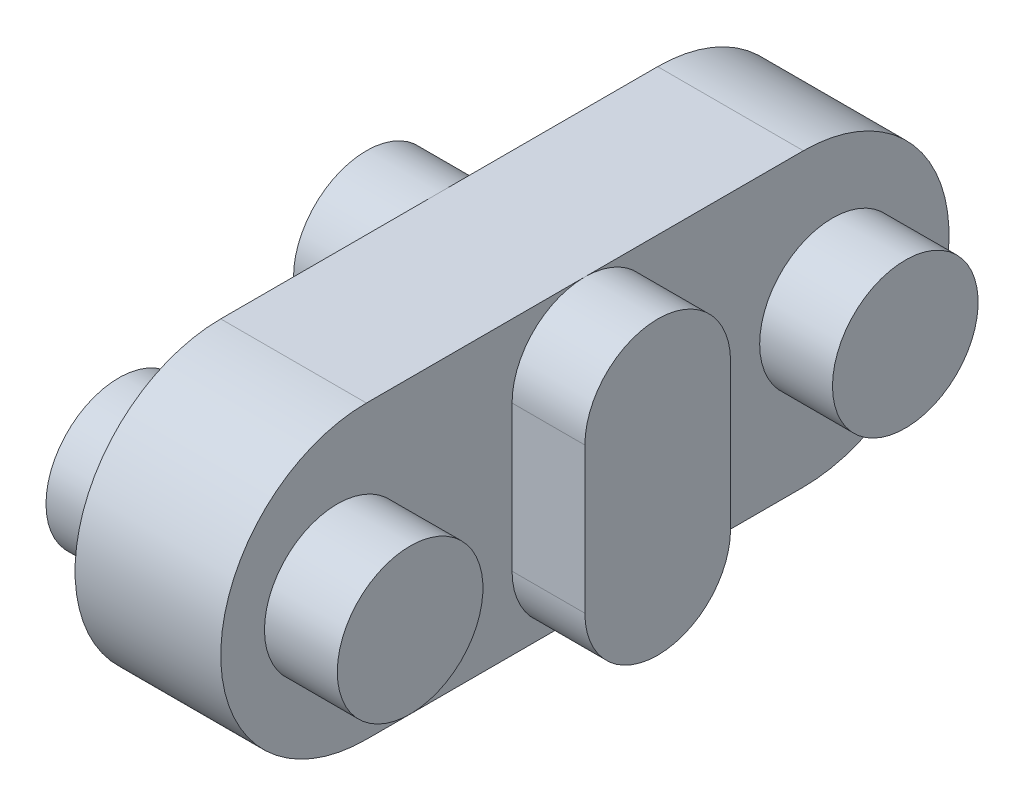
ISO-10303-21;
HEADER;
FILE_DESCRIPTION(('STEP AP214'),'2;1');
FILE_NAME('part.step','',(''),(''),'','','');
FILE_SCHEMA(('AUTOMOTIVE_DESIGN { 1 0 10303 214 1 1 1 1 }'));
ENDSEC;
DATA;
#1=APPLICATION_CONTEXT('core data for automotive mechanical design processes');
#2=APPLICATION_PROTOCOL_DEFINITION('international standard','automotive_design',2000,#1);
#3=PRODUCT_CONTEXT('',#1,'mechanical');
#4=PRODUCT('Part','Part','',(#3));
#5=PRODUCT_RELATED_PRODUCT_CATEGORY('part','',(#4));
#6=PRODUCT_DEFINITION_FORMATION('','',#4);
#7=PRODUCT_DEFINITION_CONTEXT('part definition',#1,'design');
#8=PRODUCT_DEFINITION('design','',#6,#7);
#9=PRODUCT_DEFINITION_SHAPE('','',#8);
#10=(LENGTH_UNIT() NAMED_UNIT(*) SI_UNIT(.MILLI.,.METRE.));
#11=(NAMED_UNIT(*) PLANE_ANGLE_UNIT() SI_UNIT($,.RADIAN.));
#12=(NAMED_UNIT(*) SI_UNIT($,.STERADIAN.) SOLID_ANGLE_UNIT());
#13=UNCERTAINTY_MEASURE_WITH_UNIT(LENGTH_MEASURE(1.E-05),#10,'distance_accuracy_value','');
#14=(GEOMETRIC_REPRESENTATION_CONTEXT(3) GLOBAL_UNCERTAINTY_ASSIGNED_CONTEXT((#13)) GLOBAL_UNIT_ASSIGNED_CONTEXT((#10,
#11,#12)) REPRESENTATION_CONTEXT('',''));
#15=CARTESIAN_POINT('',(0.,0.,0.));
#16=DIRECTION('',(0.,0.,1.));
#17=DIRECTION('',(1.,0.,0.));
#18=AXIS2_PLACEMENT_3D('',#15,#16,#17);
#19=CARTESIAN_POINT('',(0.,-5.,5.));
#20=DIRECTION('',(1.,0.,0.));
#21=DIRECTION('',(0.,0.,-1.));
#22=AXIS2_PLACEMENT_3D('',#19,#20,#21);
#23=PLANE('',#22);
#24=CARTESIAN_POINT('',(0.,-5.,4.));
#25=DIRECTION('',(-1.,0.,0.));
#26=DIRECTION('',(0.,0.,1.));
#27=AXIS2_PLACEMENT_3D('',#24,#25,#26);
#28=CIRCLE('',#27,2.5);
#29=CARTESIAN_POINT('',(0.,-5.,6.5));
#30=VERTEX_POINT('',#29);
#31=EDGE_CURVE('E164',#30,#30,#28,.T.);
#32=ORIENTED_EDGE('',*,*,#31,.F.);
#33=EDGE_LOOP('',(#32));
#34=FACE_BOUND('',#33,.T.);
#35=DIRECTION('',(0.,-1.,0.));
#36=VECTOR('',#35,1.);
#37=CARTESIAN_POINT('',(0.,-2.5,10.));
#38=LINE('',#37,#36);
#39=CARTESIAN_POINT('',(0.,-2.5,10.));
#40=VERTEX_POINT('',#39);
#41=CARTESIAN_POINT('',(0.,-7.5,10.));
#42=VERTEX_POINT('',#41);
#43=EDGE_CURVE('E54',#40,#42,#38,.T.);
#44=ORIENTED_EDGE('',*,*,#43,.F.);
#45=CARTESIAN_POINT('',(0.,-2.5,12.5));
#46=DIRECTION('',(1.,0.,0.));
#47=DIRECTION('',(0.,0.,-1.));
#48=AXIS2_PLACEMENT_3D('',#45,#46,#47);
#49=CIRCLE('',#48,2.5);
#50=CARTESIAN_POINT('',(0.,0.,12.5));
#51=VERTEX_POINT('',#50);
#52=EDGE_CURVE('E182',#51,#40,#49,.F.);
#53=ORIENTED_EDGE('',*,*,#52,.F.);
#54=DIRECTION('',(0.,0.,1.));
#55=VECTOR('',#54,1.);
#56=CARTESIAN_POINT('',(0.,0.,5.));
#57=LINE('',#56,#55);
#58=CARTESIAN_POINT('',(0.,0.,5.));
#59=VERTEX_POINT('',#58);
#60=EDGE_CURVE('E225',#59,#51,#57,.T.);
#61=ORIENTED_EDGE('',*,*,#60,.F.);
#62=CARTESIAN_POINT('',(0.,-5.,5.));
#63=DIRECTION('',(1.,0.,0.));
#64=DIRECTION('',(0.,0.,-1.));
#65=AXIS2_PLACEMENT_3D('',#62,#63,#64);
#66=CIRCLE('',#65,5.);
#67=CARTESIAN_POINT('',(0.,-10.,5.));
#68=VERTEX_POINT('',#67);
#69=EDGE_CURVE('E220',#68,#59,#66,.T.);
#70=ORIENTED_EDGE('',*,*,#69,.F.);
#71=DIRECTION('',(0.,0.,-1.));
#72=VECTOR('',#71,1.);
#73=CARTESIAN_POINT('',(0.,-10.,20.));
#74=LINE('',#73,#72);
#75=CARTESIAN_POINT('',(0.,-10.,12.5));
#76=VERTEX_POINT('',#75);
#77=EDGE_CURVE('E231',#76,#68,#74,.T.);
#78=ORIENTED_EDGE('',*,*,#77,.F.);
#79=CARTESIAN_POINT('',(0.,-7.5,12.5));
#80=DIRECTION('',(1.,0.,0.));
#81=DIRECTION('',(0.,0.,-1.));
#82=AXIS2_PLACEMENT_3D('',#79,#80,#81);
#83=CIRCLE('',#82,2.5);
#84=EDGE_CURVE('E59',#42,#76,#83,.F.);
#85=ORIENTED_EDGE('',*,*,#84,.F.);
#86=EDGE_LOOP('',(#44,#53,#61,#70,#78,#85));
#87=FACE_BOUND('',#86,.T.);
#88=ADVANCED_FACE('F39',(#34,#87),#23,.F.);
#89=CARTESIAN_POINT('',(0.,-5.,21.));
#90=DIRECTION('',(-1.,0.,0.));
#91=DIRECTION('',(0.,0.,1.));
#92=AXIS2_PLACEMENT_3D('',#89,#90,#91);
#93=CIRCLE('',#92,2.5);
#94=CARTESIAN_POINT('',(0.,-5.,23.5));
#95=VERTEX_POINT('',#94);
#96=EDGE_CURVE('E543',#95,#95,#93,.T.);
#97=ORIENTED_EDGE('',*,*,#96,.F.);
#98=EDGE_LOOP('',(#97));
#99=FACE_BOUND('',#98,.T.);
#100=CARTESIAN_POINT('',(0.,-7.5,15.));
#101=VERTEX_POINT('',#100);
#102=EDGE_CURVE('E146',#76,#101,#83,.F.);
#103=ORIENTED_EDGE('',*,*,#102,.F.);
#104=CARTESIAN_POINT('',(0.,-10.,20.));
#105=VERTEX_POINT('',#104);
#106=EDGE_CURVE('E232',#105,#76,#74,.T.);
#107=ORIENTED_EDGE('',*,*,#106,.F.);
#108=CARTESIAN_POINT('',(0.,-5.,20.));
#109=DIRECTION('',(1.,0.,0.));
#110=DIRECTION('',(0.,0.,-1.));
#111=AXIS2_PLACEMENT_3D('',#108,#109,#110);
#112=CIRCLE('',#111,5.);
#113=CARTESIAN_POINT('',(0.,0.,20.));
#114=VERTEX_POINT('',#113);
#115=EDGE_CURVE('E228',#114,#105,#112,.T.);
#116=ORIENTED_EDGE('',*,*,#115,.F.);
#117=EDGE_CURVE('E223',#51,#114,#57,.T.);
#118=ORIENTED_EDGE('',*,*,#117,.F.);
#119=CARTESIAN_POINT('',(0.,-2.5,15.));
#120=VERTEX_POINT('',#119);
#121=EDGE_CURVE('E178',#120,#51,#49,.F.);
#122=ORIENTED_EDGE('',*,*,#121,.F.);
#123=DIRECTION('',(0.,1.,0.));
#124=VECTOR('',#123,1.);
#125=CARTESIAN_POINT('',(0.,-7.5,15.));
#126=LINE('',#125,#124);
#127=EDGE_CURVE('E181',#101,#120,#126,.T.);
#128=ORIENTED_EDGE('',*,*,#127,.F.);
#129=EDGE_LOOP('',(#103,#107,#116,#118,#122,#128));
#130=FACE_BOUND('',#129,.T.);
#131=ADVANCED_FACE('F318',(#99,#130),#23,.F.);
#132=CARTESIAN_POINT('',(5.00229629775137,-5.,5.));
#133=DIRECTION('',(1.,0.,0.));
#134=DIRECTION('',(0.,0.,-1.));
#135=AXIS2_PLACEMENT_3D('',#132,#133,#134);
#136=PLANE('',#135);
#137=CARTESIAN_POINT('',(5.00229629775137,-5.,4.));
#138=DIRECTION('',(1.,0.,0.));
#139=DIRECTION('',(0.,0.,-1.));
#140=AXIS2_PLACEMENT_3D('',#137,#138,#139);
#141=CIRCLE('',#140,2.5);
#142=CARTESIAN_POINT('',(5.00229629775137,-5.,1.5));
#143=VERTEX_POINT('',#142);
#144=EDGE_CURVE('E47',#143,#143,#141,.T.);
#145=ORIENTED_EDGE('',*,*,#144,.F.);
#146=EDGE_LOOP('',(#145));
#147=FACE_BOUND('',#146,.T.);
#148=CARTESIAN_POINT('',(5.00229629775137,-2.5,12.5));
#149=DIRECTION('',(1.,0.,0.));
#150=DIRECTION('',(0.,0.,-1.));
#151=AXIS2_PLACEMENT_3D('',#148,#149,#150);
#152=CIRCLE('',#151,2.5);
#153=CARTESIAN_POINT('',(5.00229629775137,0.,12.5));
#154=VERTEX_POINT('',#153);
#155=CARTESIAN_POINT('',(5.00229629775137,-2.5,10.));
#156=VERTEX_POINT('',#155);
#157=EDGE_CURVE('E219',#154,#156,#152,.F.);
#158=ORIENTED_EDGE('',*,*,#157,.T.);
#159=DIRECTION('',(0.,-1.,0.));
#160=VECTOR('',#159,1.);
#161=CARTESIAN_POINT('',(5.00229629775137,-7.5,10.));
#162=LINE('',#161,#160);
#163=CARTESIAN_POINT('',(5.00229629775137,-7.5,10.));
#164=VERTEX_POINT('',#163);
#165=EDGE_CURVE('E206',#156,#164,#162,.T.);
#166=ORIENTED_EDGE('',*,*,#165,.T.);
#167=CARTESIAN_POINT('',(5.00229629775137,-7.5,12.5));
#168=DIRECTION('',(1.,0.,0.));
#169=DIRECTION('',(0.,0.,-1.));
#170=AXIS2_PLACEMENT_3D('',#167,#168,#169);
#171=CIRCLE('',#170,2.5);
#172=CARTESIAN_POINT('',(5.00229629775137,-10.,12.5));
#173=VERTEX_POINT('',#172);
#174=EDGE_CURVE('E210',#164,#173,#171,.F.);
#175=ORIENTED_EDGE('',*,*,#174,.T.);
#176=DIRECTION('',(0.,0.,-1.));
#177=VECTOR('',#176,1.);
#178=CARTESIAN_POINT('',(5.00229629775137,-10.,20.));
#179=LINE('',#178,#177);
#180=CARTESIAN_POINT('',(5.00229629775137,-10.,5.));
#181=VERTEX_POINT('',#180);
#182=EDGE_CURVE('E245',#173,#181,#179,.T.);
#183=ORIENTED_EDGE('',*,*,#182,.T.);
#184=CARTESIAN_POINT('',(5.00229629775137,-5.,5.));
#185=DIRECTION('',(1.,0.,0.));
#186=DIRECTION('',(0.,0.,-1.));
#187=AXIS2_PLACEMENT_3D('',#184,#185,#186);
#188=CIRCLE('',#187,5.);
#189=CARTESIAN_POINT('',(5.00229629775137,0.,5.));
#190=VERTEX_POINT('',#189);
#191=EDGE_CURVE('E209',#181,#190,#188,.T.);
#192=ORIENTED_EDGE('',*,*,#191,.T.);
#193=DIRECTION('',(0.,0.,1.));
#194=VECTOR('',#193,1.);
#195=CARTESIAN_POINT('',(5.00229629775137,0.,5.));
#196=LINE('',#195,#194);
#197=EDGE_CURVE('E239',#190,#154,#196,.T.);
#198=ORIENTED_EDGE('',*,*,#197,.T.);
#199=EDGE_LOOP('',(#158,#166,#175,#183,#192,#198));
#200=FACE_BOUND('',#199,.T.);
#201=ADVANCED_FACE('F265',(#147,#200),#136,.T.);
#202=CARTESIAN_POINT('',(0.,-5.,5.));
#203=DIRECTION('',(1.,0.,0.));
#204=DIRECTION('',(0.,0.,-1.));
#205=AXIS2_PLACEMENT_3D('',#202,#203,#204);
#206=CYLINDRICAL_SURFACE('',#205,5.);
#207=ORIENTED_EDGE('',*,*,#191,.F.);
#208=DIRECTION('',(1.,0.,0.));
#209=VECTOR('',#208,1.);
#210=CARTESIAN_POINT('',(0.,-10.,5.));
#211=LINE('',#210,#209);
#212=EDGE_CURVE('E248',#68,#181,#211,.T.);
#213=ORIENTED_EDGE('',*,*,#212,.F.);
#214=ORIENTED_EDGE('',*,*,#69,.T.);
#215=DIRECTION('',(1.,0.,0.));
#216=VECTOR('',#215,1.);
#217=CARTESIAN_POINT('',(0.,0.,5.));
#218=LINE('',#217,#216);
#219=EDGE_CURVE('E235',#59,#190,#218,.T.);
#220=ORIENTED_EDGE('',*,*,#219,.T.);
#221=EDGE_LOOP('',(#207,#213,#214,#220));
#222=FACE_BOUND('',#221,.T.);
#223=ADVANCED_FACE('F41',(#222),#206,.T.);
#224=CARTESIAN_POINT('',(0.,-10.,20.));
#225=DIRECTION('',(0.,-1.,0.));
#226=DIRECTION('',(0.,0.,-1.));
#227=AXIS2_PLACEMENT_3D('',#224,#225,#226);
#228=PLANE('',#227);
#229=CARTESIAN_POINT('',(5.00229629775137,-10.,20.));
#230=VERTEX_POINT('',#229);
#231=EDGE_CURVE('E224',#230,#173,#179,.T.);
#232=ORIENTED_EDGE('',*,*,#231,.F.);
#233=DIRECTION('',(1.,0.,0.));
#234=VECTOR('',#233,1.);
#235=CARTESIAN_POINT('',(0.,-10.,20.));
#236=LINE('',#235,#234);
#237=EDGE_CURVE('E251',#105,#230,#236,.T.);
#238=ORIENTED_EDGE('',*,*,#237,.F.);
#239=ORIENTED_EDGE('',*,*,#106,.T.);
#240=ORIENTED_EDGE('',*,*,#77,.T.);
#241=ORIENTED_EDGE('',*,*,#212,.T.);
#242=ORIENTED_EDGE('',*,*,#182,.F.);
#243=EDGE_LOOP('',(#232,#238,#239,#240,#241,#242));
#244=FACE_BOUND('',#243,.T.);
#245=ADVANCED_FACE('F285',(#244),#228,.T.);
#246=CARTESIAN_POINT('',(0.,-5.,20.));
#247=DIRECTION('',(1.,0.,0.));
#248=DIRECTION('',(0.,0.,-1.));
#249=AXIS2_PLACEMENT_3D('',#246,#247,#248);
#250=CYLINDRICAL_SURFACE('',#249,5.);
#251=CARTESIAN_POINT('',(5.00229629775137,-5.,20.));
#252=DIRECTION('',(1.,0.,0.));
#253=DIRECTION('',(0.,0.,-1.));
#254=AXIS2_PLACEMENT_3D('',#251,#252,#253);
#255=CIRCLE('',#254,5.);
#256=CARTESIAN_POINT('',(5.00229629775137,0.,20.));
#257=VERTEX_POINT('',#256);
#258=EDGE_CURVE('E242',#257,#230,#255,.T.);
#259=ORIENTED_EDGE('',*,*,#258,.F.);
#260=DIRECTION('',(1.,0.,0.));
#261=VECTOR('',#260,1.);
#262=CARTESIAN_POINT('',(0.,0.,20.));
#263=LINE('',#262,#261);
#264=EDGE_CURVE('E253',#114,#257,#263,.T.);
#265=ORIENTED_EDGE('',*,*,#264,.F.);
#266=ORIENTED_EDGE('',*,*,#115,.T.);
#267=ORIENTED_EDGE('',*,*,#237,.T.);
#268=EDGE_LOOP('',(#259,#265,#266,#267));
#269=FACE_BOUND('',#268,.T.);
#270=ADVANCED_FACE('F281',(#269),#250,.T.);
#271=CARTESIAN_POINT('',(0.,0.,5.));
#272=DIRECTION('',(0.,1.,0.));
#273=DIRECTION('',(0.,0.,1.));
#274=AXIS2_PLACEMENT_3D('',#271,#272,#273);
#275=PLANE('',#274);
#276=ORIENTED_EDGE('',*,*,#197,.F.);
#277=ORIENTED_EDGE('',*,*,#219,.F.);
#278=ORIENTED_EDGE('',*,*,#60,.T.);
#279=ORIENTED_EDGE('',*,*,#117,.T.);
#280=ORIENTED_EDGE('',*,*,#264,.T.);
#281=EDGE_CURVE('E238',#154,#257,#196,.T.);
#282=ORIENTED_EDGE('',*,*,#281,.F.);
#283=EDGE_LOOP('',(#276,#277,#278,#279,#280,#282));
#284=FACE_BOUND('',#283,.T.);
#285=ADVANCED_FACE('F275',(#284),#275,.T.);
#286=CARTESIAN_POINT('',(5.00229629775137,-5.,21.));
#287=DIRECTION('',(1.,0.,0.));
#288=DIRECTION('',(0.,0.,-1.));
#289=AXIS2_PLACEMENT_3D('',#286,#287,#288);
#290=CIRCLE('',#289,2.5);
#291=CARTESIAN_POINT('',(5.00229629775137,-5.,18.5));
#292=VERTEX_POINT('',#291);
#293=EDGE_CURVE('E11',#292,#292,#290,.T.);
#294=ORIENTED_EDGE('',*,*,#293,.F.);
#295=EDGE_LOOP('',(#294));
#296=FACE_BOUND('',#295,.T.);
#297=ORIENTED_EDGE('',*,*,#231,.T.);
#298=CARTESIAN_POINT('',(5.00229629775137,-7.5,15.));
#299=VERTEX_POINT('',#298);
#300=EDGE_CURVE('E214',#173,#299,#171,.F.);
#301=ORIENTED_EDGE('',*,*,#300,.T.);
#302=DIRECTION('',(0.,1.,0.));
#303=VECTOR('',#302,1.);
#304=CARTESIAN_POINT('',(5.00229629775137,-2.5,15.));
#305=LINE('',#304,#303);
#306=CARTESIAN_POINT('',(5.00229629775137,-2.5,15.));
#307=VERTEX_POINT('',#306);
#308=EDGE_CURVE('E213',#299,#307,#305,.T.);
#309=ORIENTED_EDGE('',*,*,#308,.T.);
#310=EDGE_CURVE('E200',#307,#154,#152,.F.);
#311=ORIENTED_EDGE('',*,*,#310,.T.);
#312=ORIENTED_EDGE('',*,*,#281,.T.);
#313=ORIENTED_EDGE('',*,*,#258,.T.);
#314=EDGE_LOOP('',(#297,#301,#309,#311,#312,#313));
#315=FACE_BOUND('',#314,.T.);
#316=ADVANCED_FACE('F273',(#296,#315),#136,.T.);
#317=CARTESIAN_POINT('',(-0.0019999999999968,-2.5,15.));
#318=DIRECTION('',(0.,0.,1.));
#319=DIRECTION('',(1.,0.,0.));
#320=AXIS2_PLACEMENT_3D('',#317,#318,#319);
#321=PLANE('',#320);
#322=ORIENTED_EDGE('',*,*,#308,.F.);
#323=DIRECTION('',(1.,0.,0.));
#324=VECTOR('',#323,1.);
#325=CARTESIAN_POINT('',(-0.0019999999999968,-7.5,15.));
#326=LINE('',#325,#324);
#327=CARTESIAN_POINT('',(7.50229629775137,-7.5,15.));
#328=VERTEX_POINT('',#327);
#329=EDGE_CURVE('E201',#299,#328,#326,.T.);
#330=ORIENTED_EDGE('',*,*,#329,.T.);
#331=DIRECTION('',(0.,-1.,0.));
#332=VECTOR('',#331,1.);
#333=CARTESIAN_POINT('',(7.50229629775137,-2.5,15.));
#334=LINE('',#333,#332);
#335=CARTESIAN_POINT('',(7.50229629775137,-2.5,15.));
#336=VERTEX_POINT('',#335);
#337=EDGE_CURVE('E193',#336,#328,#334,.T.);
#338=ORIENTED_EDGE('',*,*,#337,.F.);
#339=DIRECTION('',(1.,0.,0.));
#340=VECTOR('',#339,1.);
#341=CARTESIAN_POINT('',(-0.0019999999999968,-2.5,15.));
#342=LINE('',#341,#340);
#343=EDGE_CURVE('E198',#307,#336,#342,.T.);
#344=ORIENTED_EDGE('',*,*,#343,.F.);
#345=EDGE_LOOP('',(#322,#330,#338,#344));
#346=FACE_BOUND('',#345,.T.);
#347=ADVANCED_FACE('F300',(#346),#321,.T.);
#348=CARTESIAN_POINT('',(-0.0019999999999968,-7.5,12.5));
#349=DIRECTION('',(1.,0.,0.));
#350=DIRECTION('',(0.,0.,-1.));
#351=AXIS2_PLACEMENT_3D('',#348,#349,#350);
#352=CYLINDRICAL_SURFACE('',#351,2.5);
#353=ORIENTED_EDGE('',*,*,#329,.F.);
#354=ORIENTED_EDGE('',*,*,#300,.F.);
#355=ORIENTED_EDGE('',*,*,#174,.F.);
#356=DIRECTION('',(1.,0.,0.));
#357=VECTOR('',#356,1.);
#358=CARTESIAN_POINT('',(-0.0019999999999968,-7.5,10.));
#359=LINE('',#358,#357);
#360=CARTESIAN_POINT('',(7.50229629775137,-7.5,10.));
#361=VERTEX_POINT('',#360);
#362=EDGE_CURVE('E203',#164,#361,#359,.T.);
#363=ORIENTED_EDGE('',*,*,#362,.T.);
#364=CARTESIAN_POINT('',(7.50229629775137,-7.5,12.5));
#365=DIRECTION('',(1.,0.,0.));
#366=DIRECTION('',(0.,0.,-1.));
#367=AXIS2_PLACEMENT_3D('',#364,#365,#366);
#368=CIRCLE('',#367,2.5);
#369=EDGE_CURVE('E190',#328,#361,#368,.T.);
#370=ORIENTED_EDGE('',*,*,#369,.F.);
#371=EDGE_LOOP('',(#353,#354,#355,#363,#370));
#372=FACE_BOUND('',#371,.T.);
#373=ADVANCED_FACE('F291',(#372),#352,.T.);
#374=CARTESIAN_POINT('',(7.50229629775137,-2.5,12.5));
#375=DIRECTION('',(1.,0.,0.));
#376=DIRECTION('',(0.,0.,-1.));
#377=AXIS2_PLACEMENT_3D('',#374,#375,#376);
#378=PLANE('',#377);
#379=CARTESIAN_POINT('',(7.50229629775137,-2.5,12.5));
#380=DIRECTION('',(1.,0.,0.));
#381=DIRECTION('',(0.,0.,-1.));
#382=AXIS2_PLACEMENT_3D('',#379,#380,#381);
#383=CIRCLE('',#382,2.5);
#384=CARTESIAN_POINT('',(7.50229629775137,-2.5,10.));
#385=VERTEX_POINT('',#384);
#386=EDGE_CURVE('E184',#385,#336,#383,.T.);
#387=ORIENTED_EDGE('',*,*,#386,.T.);
#388=ORIENTED_EDGE('',*,*,#337,.T.);
#389=ORIENTED_EDGE('',*,*,#369,.T.);
#390=DIRECTION('',(0.,1.,0.));
#391=VECTOR('',#390,1.);
#392=CARTESIAN_POINT('',(7.50229629775137,-7.5,10.));
#393=LINE('',#392,#391);
#394=EDGE_CURVE('E186',#361,#385,#393,.T.);
#395=ORIENTED_EDGE('',*,*,#394,.T.);
#396=EDGE_LOOP('',(#387,#388,#389,#395));
#397=FACE_BOUND('',#396,.T.);
#398=ADVANCED_FACE('F297',(#397),#378,.T.);
#399=CARTESIAN_POINT('',(-0.0019999999999968,-2.5,12.5));
#400=DIRECTION('',(1.,0.,0.));
#401=DIRECTION('',(0.,0.,-1.));
#402=AXIS2_PLACEMENT_3D('',#399,#400,#401);
#403=CYLINDRICAL_SURFACE('',#402,2.5);
#404=DIRECTION('',(1.,0.,0.));
#405=VECTOR('',#404,1.);
#406=CARTESIAN_POINT('',(-0.0019999999999968,-2.5,10.));
#407=LINE('',#406,#405);
#408=EDGE_CURVE('E189',#156,#385,#407,.T.);
#409=ORIENTED_EDGE('',*,*,#408,.F.);
#410=ORIENTED_EDGE('',*,*,#157,.F.);
#411=ORIENTED_EDGE('',*,*,#310,.F.);
#412=ORIENTED_EDGE('',*,*,#343,.T.);
#413=ORIENTED_EDGE('',*,*,#386,.F.);
#414=EDGE_LOOP('',(#409,#410,#411,#412,#413));
#415=FACE_BOUND('',#414,.T.);
#416=ADVANCED_FACE('F269',(#415),#403,.T.);
#417=CARTESIAN_POINT('',(-0.0019999999999968,-7.5,10.));
#418=DIRECTION('',(0.,0.,-1.));
#419=DIRECTION('',(-1.,0.,0.));
#420=AXIS2_PLACEMENT_3D('',#417,#418,#419);
#421=PLANE('',#420);
#422=ORIENTED_EDGE('',*,*,#165,.F.);
#423=ORIENTED_EDGE('',*,*,#408,.T.);
#424=ORIENTED_EDGE('',*,*,#394,.F.);
#425=ORIENTED_EDGE('',*,*,#362,.F.);
#426=EDGE_LOOP('',(#422,#423,#424,#425));
#427=FACE_BOUND('',#426,.T.);
#428=ADVANCED_FACE('F295',(#427),#421,.T.);
#429=CARTESIAN_POINT('',(7.50429629775137,-7.5,15.));
#430=DIRECTION('',(0.,0.,1.));
#431=DIRECTION('',(1.,0.,0.));
#432=AXIS2_PLACEMENT_3D('',#429,#430,#431);
#433=PLANE('',#432);
#434=DIRECTION('',(-1.,0.,0.));
#435=VECTOR('',#434,1.);
#436=CARTESIAN_POINT('',(7.50429629775137,-7.5,15.));
#437=LINE('',#436,#435);
#438=CARTESIAN_POINT('',(-2.5,-7.5,15.));
#439=VERTEX_POINT('',#438);
#440=EDGE_CURVE('E140',#101,#439,#437,.T.);
#441=ORIENTED_EDGE('',*,*,#440,.F.);
#442=ORIENTED_EDGE('',*,*,#127,.T.);
#443=DIRECTION('',(-1.,0.,0.));
#444=VECTOR('',#443,1.);
#445=CARTESIAN_POINT('',(7.50429629775137,-2.5,15.));
#446=LINE('',#445,#444);
#447=CARTESIAN_POINT('',(-2.5,-2.5,15.));
#448=VERTEX_POINT('',#447);
#449=EDGE_CURVE('E149',#120,#448,#446,.T.);
#450=ORIENTED_EDGE('',*,*,#449,.T.);
#451=DIRECTION('',(0.,1.,0.));
#452=VECTOR('',#451,1.);
#453=CARTESIAN_POINT('',(-2.5,-7.5,15.));
#454=LINE('',#453,#452);
#455=EDGE_CURVE('E152',#439,#448,#454,.T.);
#456=ORIENTED_EDGE('',*,*,#455,.F.);
#457=EDGE_LOOP('',(#441,#442,#450,#456));
#458=FACE_BOUND('',#457,.T.);
#459=ADVANCED_FACE('F153',(#458),#433,.T.);
#460=CARTESIAN_POINT('',(-2.5,-7.5,12.5));
#461=DIRECTION('',(-1.,0.,0.));
#462=DIRECTION('',(0.,0.,1.));
#463=AXIS2_PLACEMENT_3D('',#460,#461,#462);
#464=PLANE('',#463);
#465=CARTESIAN_POINT('',(-2.5,-7.5,12.5));
#466=DIRECTION('',(-1.,0.,0.));
#467=DIRECTION('',(0.,0.,1.));
#468=AXIS2_PLACEMENT_3D('',#465,#466,#467);
#469=CIRCLE('',#468,2.5);
#470=CARTESIAN_POINT('',(-2.5,-7.5,10.));
#471=VERTEX_POINT('',#470);
#472=EDGE_CURVE('E145',#471,#439,#469,.T.);
#473=ORIENTED_EDGE('',*,*,#472,.T.);
#474=ORIENTED_EDGE('',*,*,#455,.T.);
#475=CARTESIAN_POINT('',(-2.5,-2.5,12.5));
#476=DIRECTION('',(-1.,0.,0.));
#477=DIRECTION('',(0.,0.,1.));
#478=AXIS2_PLACEMENT_3D('',#475,#476,#477);
#479=CIRCLE('',#478,2.5);
#480=CARTESIAN_POINT('',(-2.5,-2.5,10.));
#481=VERTEX_POINT('',#480);
#482=EDGE_CURVE('E158',#448,#481,#479,.T.);
#483=ORIENTED_EDGE('',*,*,#482,.T.);
#484=DIRECTION('',(0.,-1.,0.));
#485=VECTOR('',#484,1.);
#486=CARTESIAN_POINT('',(-2.5,-2.5,10.));
#487=LINE('',#486,#485);
#488=EDGE_CURVE('E163',#481,#471,#487,.T.);
#489=ORIENTED_EDGE('',*,*,#488,.T.);
#490=EDGE_LOOP('',(#473,#474,#483,#489));
#491=FACE_BOUND('',#490,.T.);
#492=ADVANCED_FACE('F161',(#491),#464,.T.);
#493=CARTESIAN_POINT('',(7.50429629775137,-7.5,12.5));
#494=DIRECTION('',(-1.,0.,0.));
#495=DIRECTION('',(0.,0.,1.));
#496=AXIS2_PLACEMENT_3D('',#493,#494,#495);
#497=CYLINDRICAL_SURFACE('',#496,2.5);
#498=ORIENTED_EDGE('',*,*,#84,.T.);
#499=ORIENTED_EDGE('',*,*,#102,.T.);
#500=ORIENTED_EDGE('',*,*,#440,.T.);
#501=ORIENTED_EDGE('',*,*,#472,.F.);
#502=DIRECTION('',(-1.,0.,0.));
#503=VECTOR('',#502,1.);
#504=CARTESIAN_POINT('',(7.50429629775137,-7.5,10.));
#505=LINE('',#504,#503);
#506=EDGE_CURVE('E172',#42,#471,#505,.T.);
#507=ORIENTED_EDGE('',*,*,#506,.F.);
#508=EDGE_LOOP('',(#498,#499,#500,#501,#507));
#509=FACE_BOUND('',#508,.T.);
#510=ADVANCED_FACE('F142',(#509),#497,.T.);
#511=CARTESIAN_POINT('',(7.50429629775137,-2.5,12.5));
#512=DIRECTION('',(-1.,0.,0.));
#513=DIRECTION('',(0.,0.,1.));
#514=AXIS2_PLACEMENT_3D('',#511,#512,#513);
#515=CYLINDRICAL_SURFACE('',#514,2.5);
#516=ORIENTED_EDGE('',*,*,#121,.T.);
#517=ORIENTED_EDGE('',*,*,#52,.T.);
#518=DIRECTION('',(-1.,0.,0.));
#519=VECTOR('',#518,1.);
#520=CARTESIAN_POINT('',(7.50429629775137,-2.5,10.));
#521=LINE('',#520,#519);
#522=EDGE_CURVE('E174',#40,#481,#521,.T.);
#523=ORIENTED_EDGE('',*,*,#522,.T.);
#524=ORIENTED_EDGE('',*,*,#482,.F.);
#525=ORIENTED_EDGE('',*,*,#449,.F.);
#526=EDGE_LOOP('',(#516,#517,#523,#524,#525));
#527=FACE_BOUND('',#526,.T.);
#528=ADVANCED_FACE('F314',(#527),#515,.T.);
#529=CARTESIAN_POINT('',(7.50429629775137,-2.5,10.));
#530=DIRECTION('',(0.,0.,-1.));
#531=DIRECTION('',(-1.,0.,0.));
#532=AXIS2_PLACEMENT_3D('',#529,#530,#531);
#533=PLANE('',#532);
#534=ORIENTED_EDGE('',*,*,#522,.F.);
#535=ORIENTED_EDGE('',*,*,#43,.T.);
#536=ORIENTED_EDGE('',*,*,#506,.T.);
#537=ORIENTED_EDGE('',*,*,#488,.F.);
#538=EDGE_LOOP('',(#534,#535,#536,#537));
#539=FACE_BOUND('',#538,.T.);
#540=ADVANCED_FACE('F303',(#539),#533,.T.);
#541=CARTESIAN_POINT('',(0.,-5.,4.));
#542=DIRECTION('',(-1.,0.,0.));
#543=DIRECTION('',(0.,0.,1.));
#544=AXIS2_PLACEMENT_3D('',#541,#542,#543);
#545=CYLINDRICAL_SURFACE('',#544,2.5);
#546=ORIENTED_EDGE('',*,*,#31,.T.);
#547=EDGE_LOOP('',(#546));
#548=FACE_BOUND('',#547,.T.);
#549=CARTESIAN_POINT('',(-2.49770370224863,-5.,4.));
#550=DIRECTION('',(-1.,0.,0.));
#551=DIRECTION('',(0.,0.,1.));
#552=AXIS2_PLACEMENT_3D('',#549,#550,#551);
#553=CIRCLE('',#552,2.5);
#554=CARTESIAN_POINT('',(-2.49770370224863,-5.,6.5));
#555=VERTEX_POINT('',#554);
#556=EDGE_CURVE('E167',#555,#555,#553,.T.);
#557=ORIENTED_EDGE('',*,*,#556,.F.);
#558=EDGE_LOOP('',(#557));
#559=FACE_BOUND('',#558,.T.);
#560=ADVANCED_FACE('F313',(#548,#559),#545,.T.);
#561=CARTESIAN_POINT('',(-2.49770370224863,-5.,4.));
#562=DIRECTION('',(-1.,0.,0.));
#563=DIRECTION('',(0.,0.,1.));
#564=AXIS2_PLACEMENT_3D('',#561,#562,#563);
#565=PLANE('',#564);
#566=ORIENTED_EDGE('',*,*,#556,.T.);
#567=EDGE_LOOP('',(#566));
#568=FACE_BOUND('',#567,.T.);
#569=ADVANCED_FACE('F408',(#568),#565,.T.);
#570=CARTESIAN_POINT('',(7.50229629775137,-5.,4.));
#571=DIRECTION('',(-1.,0.,0.));
#572=DIRECTION('',(0.,0.,1.));
#573=AXIS2_PLACEMENT_3D('',#570,#571,#572);
#574=CYLINDRICAL_SURFACE('',#573,2.5);
#575=CARTESIAN_POINT('',(7.50229629775137,-5.,4.));
#576=DIRECTION('',(-1.,0.,0.));
#577=DIRECTION('',(0.,0.,1.));
#578=AXIS2_PLACEMENT_3D('',#575,#576,#577);
#579=CIRCLE('',#578,2.5);
#580=CARTESIAN_POINT('',(7.50229629775137,-5.,6.5));
#581=VERTEX_POINT('',#580);
#582=EDGE_CURVE('E537',#581,#581,#579,.T.);
#583=ORIENTED_EDGE('',*,*,#582,.T.);
#584=EDGE_LOOP('',(#583));
#585=FACE_BOUND('',#584,.T.);
#586=ORIENTED_EDGE('',*,*,#144,.T.);
#587=EDGE_LOOP('',(#586));
#588=FACE_BOUND('',#587,.T.);
#589=ADVANCED_FACE('F404',(#585,#588),#574,.T.);
#590=CARTESIAN_POINT('',(7.50229629775137,-2.5,4.));
#591=DIRECTION('',(1.,0.,0.));
#592=DIRECTION('',(0.,0.,-1.));
#593=AXIS2_PLACEMENT_3D('',#590,#591,#592);
#594=PLANE('',#593);
#595=ORIENTED_EDGE('',*,*,#582,.F.);
#596=EDGE_LOOP('',(#595));
#597=FACE_BOUND('',#596,.T.);
#598=ADVANCED_FACE('F348',(#597),#594,.T.);
#599=CARTESIAN_POINT('',(7.50229629775137,-5.,21.));
#600=DIRECTION('',(-1.,0.,0.));
#601=DIRECTION('',(0.,0.,1.));
#602=AXIS2_PLACEMENT_3D('',#599,#600,#601);
#603=CYLINDRICAL_SURFACE('',#602,2.5);
#604=CARTESIAN_POINT('',(7.50229629775137,-5.,21.));
#605=DIRECTION('',(-1.,0.,0.));
#606=DIRECTION('',(0.,0.,1.));
#607=AXIS2_PLACEMENT_3D('',#604,#605,#606);
#608=CIRCLE('',#607,2.5);
#609=CARTESIAN_POINT('',(7.50229629775137,-5.,23.5));
#610=VERTEX_POINT('',#609);
#611=EDGE_CURVE('E540',#610,#610,#608,.T.);
#612=ORIENTED_EDGE('',*,*,#611,.T.);
#613=EDGE_LOOP('',(#612));
#614=FACE_BOUND('',#613,.T.);
#615=ORIENTED_EDGE('',*,*,#293,.T.);
#616=EDGE_LOOP('',(#615));
#617=FACE_BOUND('',#616,.T.);
#618=ADVANCED_FACE('F353',(#614,#617),#603,.T.);
#619=CARTESIAN_POINT('',(7.50229629775137,-2.5,21.));
#620=DIRECTION('',(1.,0.,0.));
#621=DIRECTION('',(0.,0.,-1.));
#622=AXIS2_PLACEMENT_3D('',#619,#620,#621);
#623=PLANE('',#622);
#624=ORIENTED_EDGE('',*,*,#611,.F.);
#625=EDGE_LOOP('',(#624));
#626=FACE_BOUND('',#625,.T.);
#627=ADVANCED_FACE('F358',(#626),#623,.T.);
#628=CARTESIAN_POINT('',(0.,-5.,21.));
#629=DIRECTION('',(-1.,0.,0.));
#630=DIRECTION('',(0.,0.,1.));
#631=AXIS2_PLACEMENT_3D('',#628,#629,#630);
#632=CYLINDRICAL_SURFACE('',#631,2.5);
#633=ORIENTED_EDGE('',*,*,#96,.T.);
#634=EDGE_LOOP('',(#633));
#635=FACE_BOUND('',#634,.T.);
#636=CARTESIAN_POINT('',(-2.49770370224863,-5.,21.));
#637=DIRECTION('',(-1.,0.,0.));
#638=DIRECTION('',(0.,0.,1.));
#639=AXIS2_PLACEMENT_3D('',#636,#637,#638);
#640=CIRCLE('',#639,2.5);
#641=CARTESIAN_POINT('',(-2.49770370224863,-5.,23.5));
#642=VERTEX_POINT('',#641);
#643=EDGE_CURVE('E546',#642,#642,#640,.T.);
#644=ORIENTED_EDGE('',*,*,#643,.F.);
#645=EDGE_LOOP('',(#644));
#646=FACE_BOUND('',#645,.T.);
#647=ADVANCED_FACE('F368',(#635,#646),#632,.T.);
#648=CARTESIAN_POINT('',(-2.49770370224863,-5.,21.));
#649=DIRECTION('',(-1.,0.,0.));
#650=DIRECTION('',(0.,0.,1.));
#651=AXIS2_PLACEMENT_3D('',#648,#649,#650);
#652=PLANE('',#651);
#653=ORIENTED_EDGE('',*,*,#643,.T.);
#654=EDGE_LOOP('',(#653));
#655=FACE_BOUND('',#654,.T.);
#656=ADVANCED_FACE('F387',(#655),#652,.T.);
#657=CLOSED_SHELL('',(#88,#131,#201,#223,#245,#270,#285,#316,#347,#373,#398,#416,#428,#459,#492,
#510,#528,#540,#560,#569,#589,#598,#618,#627,#647,#656));
#658=MANIFOLD_SOLID_BREP('B2',#657);
#659=ADVANCED_BREP_SHAPE_REPRESENTATION('',(#18,#658),#14);
#660=SHAPE_DEFINITION_REPRESENTATION(#9,#659);
ENDSEC;
END-ISO-10303-21;
